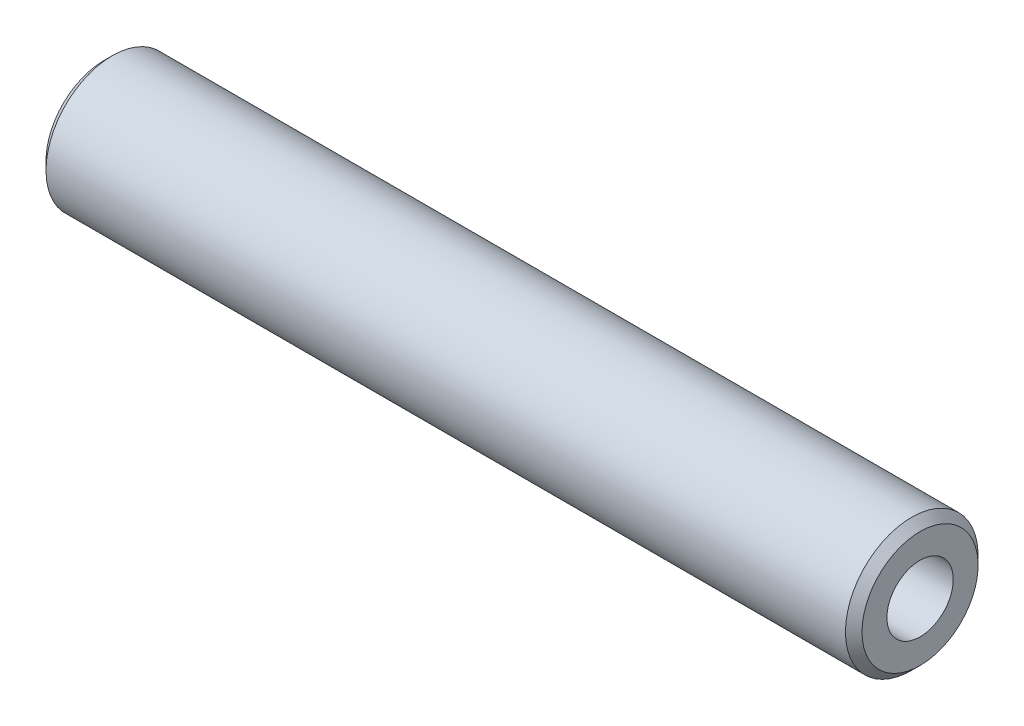
ISO-10303-21;
HEADER;
FILE_DESCRIPTION(('STEP AP214'),'2;1');
FILE_NAME('part.step','',(''),(''),'','','');
FILE_SCHEMA(('AUTOMOTIVE_DESIGN { 1 0 10303 214 1 1 1 1 }'));
ENDSEC;
DATA;
#1=APPLICATION_CONTEXT('core data for automotive mechanical design processes');
#2=APPLICATION_PROTOCOL_DEFINITION('international standard','automotive_design',2000,#1);
#3=PRODUCT_CONTEXT('',#1,'mechanical');
#4=PRODUCT('Part','Part','',(#3));
#5=PRODUCT_RELATED_PRODUCT_CATEGORY('part','',(#4));
#6=PRODUCT_DEFINITION_FORMATION('','',#4);
#7=PRODUCT_DEFINITION_CONTEXT('part definition',#1,'design');
#8=PRODUCT_DEFINITION('design','',#6,#7);
#9=PRODUCT_DEFINITION_SHAPE('','',#8);
#10=(LENGTH_UNIT() NAMED_UNIT(*) SI_UNIT(.MILLI.,.METRE.));
#11=(NAMED_UNIT(*) PLANE_ANGLE_UNIT() SI_UNIT($,.RADIAN.));
#12=(NAMED_UNIT(*) SI_UNIT($,.STERADIAN.) SOLID_ANGLE_UNIT());
#13=UNCERTAINTY_MEASURE_WITH_UNIT(LENGTH_MEASURE(1.E-05),#10,'distance_accuracy_value','');
#14=(GEOMETRIC_REPRESENTATION_CONTEXT(3) GLOBAL_UNCERTAINTY_ASSIGNED_CONTEXT((#13)) GLOBAL_UNIT_ASSIGNED_CONTEXT((#10,
#11,#12)) REPRESENTATION_CONTEXT('',''));
#15=CARTESIAN_POINT('',(0.,0.,0.));
#16=DIRECTION('',(0.,0.,1.));
#17=DIRECTION('',(1.,0.,0.));
#18=AXIS2_PLACEMENT_3D('',#15,#16,#17);
#19=CARTESIAN_POINT('',(-24.6,0.,0.));
#20=DIRECTION('',(1.,0.,0.));
#21=DIRECTION('',(0.,0.,-1.));
#22=AXIS2_PLACEMENT_3D('',#19,#20,#21);
#23=PLANE('',#22);
#24=CARTESIAN_POINT('',(-24.6,0.,0.));
#25=DIRECTION('',(1.,0.,0.));
#26=DIRECTION('',(0.,0.,-1.));
#27=AXIS2_PLACEMENT_3D('',#24,#25,#26);
#28=CIRCLE('',#27,3.5);
#29=CARTESIAN_POINT('',(-24.6,0.,-3.5));
#30=VERTEX_POINT('',#29);
#31=EDGE_CURVE('E77',#30,#30,#28,.F.);
#32=ORIENTED_EDGE('',*,*,#31,.T.);
#33=EDGE_LOOP('',(#32));
#34=FACE_BOUND('',#33,.T.);
#35=CARTESIAN_POINT('',(-24.6,0.,0.));
#36=DIRECTION('',(-1.,0.,0.));
#37=DIRECTION('',(0.,0.,1.));
#38=AXIS2_PLACEMENT_3D('',#35,#36,#37);
#39=CIRCLE('',#38,1.99999999999999);
#40=CARTESIAN_POINT('',(-24.6,0.,1.99999999999999));
#41=VERTEX_POINT('',#40);
#42=EDGE_CURVE('E58',#41,#41,#39,.T.);
#43=ORIENTED_EDGE('',*,*,#42,.F.);
#44=EDGE_LOOP('',(#43));
#45=FACE_BOUND('',#44,.T.);
#46=ADVANCED_FACE('F34',(#34,#45),#23,.F.);
#47=CARTESIAN_POINT('',(0.,0.,0.));
#48=DIRECTION('',(-1.,0.,0.));
#49=DIRECTION('',(0.,0.,1.));
#50=AXIS2_PLACEMENT_3D('',#47,#48,#49);
#51=CYLINDRICAL_SURFACE('',#50,4.);
#52=CARTESIAN_POINT('',(-24.1,0.,0.));
#53=DIRECTION('',(1.,0.,0.));
#54=DIRECTION('',(0.,0.,-1.));
#55=AXIS2_PLACEMENT_3D('',#52,#53,#54);
#56=CIRCLE('',#55,4.);
#57=CARTESIAN_POINT('',(-24.1,0.,-4.));
#58=VERTEX_POINT('',#57);
#59=EDGE_CURVE('E42',#58,#58,#56,.T.);
#60=ORIENTED_EDGE('',*,*,#59,.T.);
#61=EDGE_LOOP('',(#60));
#62=FACE_BOUND('',#61,.T.);
#63=CARTESIAN_POINT('',(24.1,0.,0.));
#64=DIRECTION('',(-1.,0.,0.));
#65=DIRECTION('',(0.,0.,1.));
#66=AXIS2_PLACEMENT_3D('',#63,#64,#65);
#67=CIRCLE('',#66,4.);
#68=CARTESIAN_POINT('',(24.1,0.,4.));
#69=VERTEX_POINT('',#68);
#70=EDGE_CURVE('E80',#69,#69,#67,.T.);
#71=ORIENTED_EDGE('',*,*,#70,.T.);
#72=EDGE_LOOP('',(#71));
#73=FACE_BOUND('',#72,.T.);
#74=ADVANCED_FACE('F85',(#62,#73),#51,.T.);
#75=CARTESIAN_POINT('',(24.6,0.,0.));
#76=DIRECTION('',(-1.,0.,0.));
#77=DIRECTION('',(0.,0.,1.));
#78=AXIS2_PLACEMENT_3D('',#75,#76,#77);
#79=PLANE('',#78);
#80=CARTESIAN_POINT('',(24.6,0.,0.));
#81=DIRECTION('',(-1.,0.,0.));
#82=DIRECTION('',(0.,0.,1.));
#83=AXIS2_PLACEMENT_3D('',#80,#81,#82);
#84=CIRCLE('',#83,3.49999999999999);
#85=CARTESIAN_POINT('',(24.6,0.,3.49999999999999));
#86=VERTEX_POINT('',#85);
#87=EDGE_CURVE('E11',#86,#86,#84,.F.);
#88=ORIENTED_EDGE('',*,*,#87,.T.);
#89=EDGE_LOOP('',(#88));
#90=FACE_BOUND('',#89,.T.);
#91=CARTESIAN_POINT('',(24.6,0.,0.));
#92=DIRECTION('',(1.,0.,0.));
#93=DIRECTION('',(0.,0.,-1.));
#94=AXIS2_PLACEMENT_3D('',#91,#92,#93);
#95=CIRCLE('',#94,1.99999999999999);
#96=CARTESIAN_POINT('',(24.6,0.,-1.99999999999999));
#97=VERTEX_POINT('',#96);
#98=EDGE_CURVE('E219',#97,#97,#95,.T.);
#99=ORIENTED_EDGE('',*,*,#98,.F.);
#100=EDGE_LOOP('',(#99));
#101=FACE_BOUND('',#100,.T.);
#102=ADVANCED_FACE('F118',(#90,#101),#79,.F.);
#103=CARTESIAN_POINT('',(-13.1,0.,0.));
#104=DIRECTION('',(-1.,0.,0.));
#105=DIRECTION('',(0.,0.,1.));
#106=AXIS2_PLACEMENT_3D('',#103,#104,#105);
#107=CONICAL_SURFACE('',#106,1.65,1.02974425867665);
#108=CARTESIAN_POINT('',(-12.1085799786045,0.,0.));
#109=VERTEX_POINT('',#108);
#110=VERTEX_LOOP('',#109);
#111=FACE_BOUND('',#110,.T.);
#112=CARTESIAN_POINT('',(-13.1,0.,0.));
#113=DIRECTION('',(-1.,0.,0.));
#114=DIRECTION('',(0.,0.,1.));
#115=AXIS2_PLACEMENT_3D('',#112,#113,#114);
#116=CIRCLE('',#115,1.65);
#117=CARTESIAN_POINT('',(-13.1,0.,1.65));
#118=VERTEX_POINT('',#117);
#119=EDGE_CURVE('E74',#118,#118,#116,.T.);
#120=ORIENTED_EDGE('',*,*,#119,.T.);
#121=EDGE_LOOP('',(#120));
#122=FACE_BOUND('',#121,.T.);
#123=ADVANCED_FACE('F114',(#111,#122),#107,.F.);
#124=CARTESIAN_POINT('',(-24.6,0.,0.));
#125=DIRECTION('',(-1.,0.,0.));
#126=DIRECTION('',(0.,0.,1.));
#127=AXIS2_PLACEMENT_3D('',#124,#125,#126);
#128=CYLINDRICAL_SURFACE('',#127,1.65);
#129=ORIENTED_EDGE('',*,*,#119,.F.);
#130=EDGE_LOOP('',(#129));
#131=FACE_BOUND('',#130,.T.);
#132=CARTESIAN_POINT('',(-16.6,0.,0.));
#133=DIRECTION('',(-1.,0.,0.));
#134=DIRECTION('',(0.,0.,1.));
#135=AXIS2_PLACEMENT_3D('',#132,#133,#134);
#136=CIRCLE('',#135,1.65);
#137=CARTESIAN_POINT('',(-16.6,0.,1.65));
#138=VERTEX_POINT('',#137);
#139=EDGE_CURVE('E71',#138,#138,#136,.T.);
#140=ORIENTED_EDGE('',*,*,#139,.T.);
#141=EDGE_LOOP('',(#140));
#142=FACE_BOUND('',#141,.T.);
#143=ADVANCED_FACE('F106',(#131,#142),#128,.F.);
#144=CARTESIAN_POINT('',(-16.6,1.65,0.));
#145=DIRECTION('',(1.,0.,0.));
#146=DIRECTION('',(0.,0.,-1.));
#147=AXIS2_PLACEMENT_3D('',#144,#145,#146);
#148=PLANE('',#147);
#149=ORIENTED_EDGE('',*,*,#139,.F.);
#150=EDGE_LOOP('',(#149));
#151=FACE_BOUND('',#150,.T.);
#152=CARTESIAN_POINT('',(-16.6,0.,0.));
#153=DIRECTION('',(-1.,0.,0.));
#154=DIRECTION('',(0.,0.,1.));
#155=AXIS2_PLACEMENT_3D('',#152,#153,#154);
#156=CIRCLE('',#155,2.);
#157=CARTESIAN_POINT('',(-16.6,0.,2.));
#158=VERTEX_POINT('',#157);
#159=EDGE_CURVE('E62',#158,#158,#156,.T.);
#160=ORIENTED_EDGE('',*,*,#159,.T.);
#161=EDGE_LOOP('',(#160));
#162=FACE_BOUND('',#161,.T.);
#163=ADVANCED_FACE('F100',(#151,#162),#148,.F.);
#164=CARTESIAN_POINT('',(-24.6,0.,0.));
#165=DIRECTION('',(-1.,0.,0.));
#166=DIRECTION('',(0.,0.,1.));
#167=AXIS2_PLACEMENT_3D('',#164,#165,#166);
#168=CYLINDRICAL_SURFACE('',#167,1.99999999999999);
#169=ORIENTED_EDGE('',*,*,#159,.F.);
#170=EDGE_LOOP('',(#169));
#171=FACE_BOUND('',#170,.T.);
#172=ORIENTED_EDGE('',*,*,#42,.T.);
#173=EDGE_LOOP('',(#172));
#174=FACE_BOUND('',#173,.T.);
#175=ADVANCED_FACE('F52',(#171,#174),#168,.F.);
#176=CARTESIAN_POINT('',(13.1,0.,0.));
#177=DIRECTION('',(1.,0.,0.));
#178=DIRECTION('',(0.,0.,-1.));
#179=AXIS2_PLACEMENT_3D('',#176,#177,#178);
#180=CONICAL_SURFACE('',#179,1.65,1.02974425867665);
#181=CARTESIAN_POINT('',(12.1085799786045,0.,0.));
#182=VERTEX_POINT('',#181);
#183=VERTEX_LOOP('',#182);
#184=FACE_BOUND('',#183,.T.);
#185=CARTESIAN_POINT('',(13.1,0.,0.));
#186=DIRECTION('',(1.,0.,0.));
#187=DIRECTION('',(0.,0.,-1.));
#188=AXIS2_PLACEMENT_3D('',#185,#186,#187);
#189=CIRCLE('',#188,1.65);
#190=CARTESIAN_POINT('',(13.1,0.,-1.65));
#191=VERTEX_POINT('',#190);
#192=EDGE_CURVE('E56',#191,#191,#189,.T.);
#193=ORIENTED_EDGE('',*,*,#192,.T.);
#194=EDGE_LOOP('',(#193));
#195=FACE_BOUND('',#194,.T.);
#196=ADVANCED_FACE('F48',(#184,#195),#180,.F.);
#197=CARTESIAN_POINT('',(24.6,0.,0.));
#198=DIRECTION('',(1.,0.,0.));
#199=DIRECTION('',(0.,0.,-1.));
#200=AXIS2_PLACEMENT_3D('',#197,#198,#199);
#201=CYLINDRICAL_SURFACE('',#200,1.65);
#202=ORIENTED_EDGE('',*,*,#192,.F.);
#203=EDGE_LOOP('',(#202));
#204=FACE_BOUND('',#203,.T.);
#205=CARTESIAN_POINT('',(16.6,0.,0.));
#206=DIRECTION('',(1.,0.,0.));
#207=DIRECTION('',(0.,0.,-1.));
#208=AXIS2_PLACEMENT_3D('',#205,#206,#207);
#209=CIRCLE('',#208,1.65);
#210=CARTESIAN_POINT('',(16.6,0.,-1.65));
#211=VERTEX_POINT('',#210);
#212=EDGE_CURVE('E59',#211,#211,#209,.T.);
#213=ORIENTED_EDGE('',*,*,#212,.T.);
#214=EDGE_LOOP('',(#213));
#215=FACE_BOUND('',#214,.T.);
#216=ADVANCED_FACE('F51',(#204,#215),#201,.F.);
#217=CARTESIAN_POINT('',(16.6,1.65,0.));
#218=DIRECTION('',(-1.,0.,0.));
#219=DIRECTION('',(0.,0.,1.));
#220=AXIS2_PLACEMENT_3D('',#217,#218,#219);
#221=PLANE('',#220);
#222=ORIENTED_EDGE('',*,*,#212,.F.);
#223=EDGE_LOOP('',(#222));
#224=FACE_BOUND('',#223,.T.);
#225=CARTESIAN_POINT('',(16.6,0.,0.));
#226=DIRECTION('',(1.,0.,0.));
#227=DIRECTION('',(0.,0.,-1.));
#228=AXIS2_PLACEMENT_3D('',#225,#226,#227);
#229=CIRCLE('',#228,2.);
#230=CARTESIAN_POINT('',(16.6,0.,-2.));
#231=VERTEX_POINT('',#230);
#232=EDGE_CURVE('E65',#231,#231,#229,.T.);
#233=ORIENTED_EDGE('',*,*,#232,.T.);
#234=EDGE_LOOP('',(#233));
#235=FACE_BOUND('',#234,.T.);
#236=ADVANCED_FACE('F166',(#224,#235),#221,.F.);
#237=CARTESIAN_POINT('',(24.6,0.,0.));
#238=DIRECTION('',(1.,0.,0.));
#239=DIRECTION('',(0.,0.,-1.));
#240=AXIS2_PLACEMENT_3D('',#237,#238,#239);
#241=CYLINDRICAL_SURFACE('',#240,1.99999999999999);
#242=ORIENTED_EDGE('',*,*,#232,.F.);
#243=EDGE_LOOP('',(#242));
#244=FACE_BOUND('',#243,.T.);
#245=ORIENTED_EDGE('',*,*,#98,.T.);
#246=EDGE_LOOP('',(#245));
#247=FACE_BOUND('',#246,.T.);
#248=ADVANCED_FACE('F91',(#244,#247),#241,.F.);
#249=CARTESIAN_POINT('',(-24.6,0.,0.));
#250=DIRECTION('',(1.,0.,0.));
#251=DIRECTION('',(0.,0.,-1.));
#252=AXIS2_PLACEMENT_3D('',#249,#250,#251);
#253=CONICAL_SURFACE('',#252,3.5,0.785398163397449);
#254=ORIENTED_EDGE('',*,*,#59,.F.);
#255=EDGE_LOOP('',(#254));
#256=FACE_BOUND('',#255,.T.);
#257=ORIENTED_EDGE('',*,*,#31,.F.);
#258=EDGE_LOOP('',(#257));
#259=FACE_BOUND('',#258,.T.);
#260=ADVANCED_FACE('F88',(#256,#259),#253,.T.);
#261=CARTESIAN_POINT('',(24.1,0.,0.));
#262=DIRECTION('',(-1.,0.,0.));
#263=DIRECTION('',(0.,0.,1.));
#264=AXIS2_PLACEMENT_3D('',#261,#262,#263);
#265=CONICAL_SURFACE('',#264,4.,0.785398163397456);
#266=ORIENTED_EDGE('',*,*,#87,.F.);
#267=EDGE_LOOP('',(#266));
#268=FACE_BOUND('',#267,.T.);
#269=ORIENTED_EDGE('',*,*,#70,.F.);
#270=EDGE_LOOP('',(#269));
#271=FACE_BOUND('',#270,.T.);
#272=ADVANCED_FACE('F36',(#268,#271),#265,.T.);
#273=CLOSED_SHELL('',(#46,#74,#102,#123,#143,#163,#175,#196,#216,#236,#248,#260,#272));
#274=MANIFOLD_SOLID_BREP('B2',#273);
#275=ADVANCED_BREP_SHAPE_REPRESENTATION('',(#18,#274),#14);
#276=SHAPE_DEFINITION_REPRESENTATION(#9,#275);
ENDSEC;
END-ISO-10303-21;
